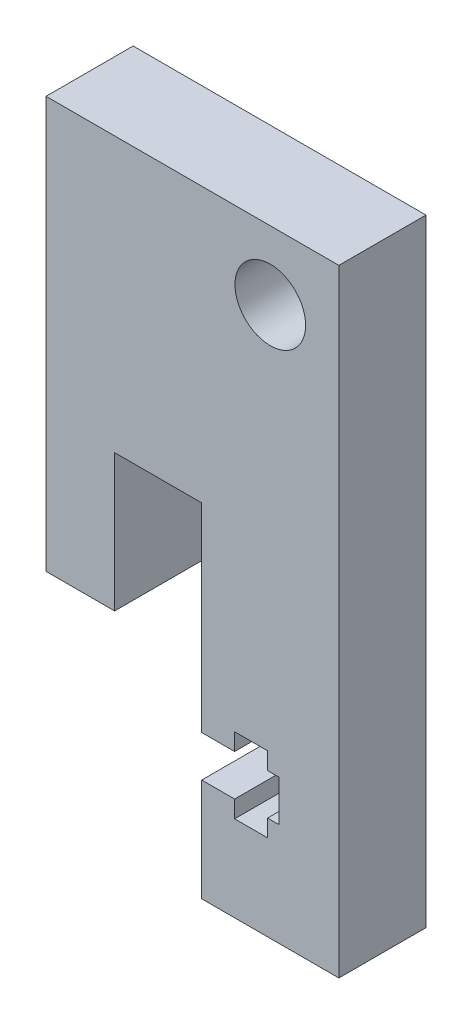
ISO-10303-21;
HEADER;
FILE_DESCRIPTION(('STEP AP214'),'2;1');
FILE_NAME('part.step','',(''),(''),'','','');
FILE_SCHEMA(('AUTOMOTIVE_DESIGN { 1 0 10303 214 1 1 1 1 }'));
ENDSEC;
DATA;
#1=APPLICATION_CONTEXT('core data for automotive mechanical design processes');
#2=APPLICATION_PROTOCOL_DEFINITION('international standard','automotive_design',2000,#1);
#3=PRODUCT_CONTEXT('',#1,'mechanical');
#4=PRODUCT('Part','Part','',(#3));
#5=PRODUCT_RELATED_PRODUCT_CATEGORY('part','',(#4));
#6=PRODUCT_DEFINITION_FORMATION('','',#4);
#7=PRODUCT_DEFINITION_CONTEXT('part definition',#1,'design');
#8=PRODUCT_DEFINITION('design','',#6,#7);
#9=PRODUCT_DEFINITION_SHAPE('','',#8);
#10=(LENGTH_UNIT() NAMED_UNIT(*) SI_UNIT(.MILLI.,.METRE.));
#11=(NAMED_UNIT(*) PLANE_ANGLE_UNIT() SI_UNIT($,.RADIAN.));
#12=(NAMED_UNIT(*) SI_UNIT($,.STERADIAN.) SOLID_ANGLE_UNIT());
#13=UNCERTAINTY_MEASURE_WITH_UNIT(LENGTH_MEASURE(1.E-05),#10,'distance_accuracy_value','');
#14=(GEOMETRIC_REPRESENTATION_CONTEXT(3) GLOBAL_UNCERTAINTY_ASSIGNED_CONTEXT((#13)) GLOBAL_UNIT_ASSIGNED_CONTEXT((#10,
#11,#12)) REPRESENTATION_CONTEXT('',''));
#15=CARTESIAN_POINT('',(0.,0.,0.));
#16=DIRECTION('',(0.,0.,1.));
#17=DIRECTION('',(1.,0.,0.));
#18=AXIS2_PLACEMENT_3D('',#15,#16,#17);
#19=CARTESIAN_POINT('',(0.940553214138688,0.,6.35));
#20=DIRECTION('',(-1.,0.,0.));
#21=DIRECTION('',(0.,-1.,0.));
#22=AXIS2_PLACEMENT_3D('',#19,#20,#21);
#23=PLANE('',#22);
#24=DIRECTION('',(0.,1.,0.));
#25=VECTOR('',#24,1.);
#26=CARTESIAN_POINT('',(0.940553214138688,0.,0.));
#27=LINE('',#26,#25);
#28=CARTESIAN_POINT('',(0.940553214138688,-4.5332697036601,0.));
#29=VERTEX_POINT('',#28);
#30=CARTESIAN_POINT('',(0.940553214138688,-3.2832697036601,0.));
#31=VERTEX_POINT('',#30);
#32=EDGE_CURVE('E217',#29,#31,#27,.T.);
#33=ORIENTED_EDGE('',*,*,#32,.T.);
#34=DIRECTION('',(0.,0.,-1.));
#35=VECTOR('',#34,1.);
#36=CARTESIAN_POINT('',(0.940553214138688,-3.2832697036601,6.35));
#37=LINE('',#36,#35);
#38=CARTESIAN_POINT('',(0.940553214138688,-3.2832697036601,6.35));
#39=VERTEX_POINT('',#38);
#40=EDGE_CURVE('E11',#39,#31,#37,.T.);
#41=ORIENTED_EDGE('',*,*,#40,.F.);
#42=DIRECTION('',(0.,1.,0.));
#43=VECTOR('',#42,1.);
#44=CARTESIAN_POINT('',(0.940553214138688,0.,6.35));
#45=LINE('',#44,#43);
#46=CARTESIAN_POINT('',(0.940553214138688,-4.5332697036601,6.35));
#47=VERTEX_POINT('',#46);
#48=EDGE_CURVE('E363',#47,#39,#45,.T.);
#49=ORIENTED_EDGE('',*,*,#48,.F.);
#50=DIRECTION('',(0.,0.,-1.));
#51=VECTOR('',#50,1.);
#52=CARTESIAN_POINT('',(0.940553214138688,-4.5332697036601,6.35));
#53=LINE('',#52,#51);
#54=EDGE_CURVE('E209',#47,#29,#53,.T.);
#55=ORIENTED_EDGE('',*,*,#54,.T.);
#56=EDGE_LOOP('',(#33,#41,#49,#55));
#57=FACE_BOUND('',#56,.T.);
#58=ADVANCED_FACE('F39',(#57),#23,.F.);
#59=CARTESIAN_POINT('',(0.,-3.2832697036601,6.35));
#60=DIRECTION('',(0.,-1.,0.));
#61=DIRECTION('',(0.,0.,-1.));
#62=AXIS2_PLACEMENT_3D('',#59,#60,#61);
#63=PLANE('',#62);
#64=DIRECTION('',(-1.,0.,0.));
#65=VECTOR('',#64,1.);
#66=CARTESIAN_POINT('',(0.,-3.2832697036601,0.));
#67=LINE('',#66,#65);
#68=CARTESIAN_POINT('',(-1.45944678586131,-3.2832697036601,0.));
#69=VERTEX_POINT('',#68);
#70=EDGE_CURVE('E221',#31,#69,#67,.T.);
#71=ORIENTED_EDGE('',*,*,#70,.T.);
#72=DIRECTION('',(0.,0.,-1.));
#73=VECTOR('',#72,1.);
#74=CARTESIAN_POINT('',(-1.45944678586131,-3.2832697036601,6.35));
#75=LINE('',#74,#73);
#76=CARTESIAN_POINT('',(-1.45944678586131,-3.2832697036601,6.35));
#77=VERTEX_POINT('',#76);
#78=EDGE_CURVE('E49',#77,#69,#75,.T.);
#79=ORIENTED_EDGE('',*,*,#78,.F.);
#80=DIRECTION('',(-1.,0.,0.));
#81=VECTOR('',#80,1.);
#82=CARTESIAN_POINT('',(0.,-3.2832697036601,6.35));
#83=LINE('',#82,#81);
#84=EDGE_CURVE('E136',#39,#77,#83,.T.);
#85=ORIENTED_EDGE('',*,*,#84,.F.);
#86=ORIENTED_EDGE('',*,*,#40,.T.);
#87=EDGE_LOOP('',(#71,#79,#85,#86));
#88=FACE_BOUND('',#87,.T.);
#89=ADVANCED_FACE('F342',(#88),#63,.F.);
#90=CARTESIAN_POINT('',(-1.45944678586131,0.,6.35));
#91=DIRECTION('',(-1.,0.,0.));
#92=DIRECTION('',(0.,0.,1.));
#93=AXIS2_PLACEMENT_3D('',#90,#91,#92);
#94=PLANE('',#93);
#95=DIRECTION('',(0.,1.,0.));
#96=VECTOR('',#95,1.);
#97=CARTESIAN_POINT('',(-1.45944678586131,0.,0.));
#98=LINE('',#97,#96);
#99=CARTESIAN_POINT('',(-1.45944678586131,-10.7832697036601,0.));
#100=VERTEX_POINT('',#99);
#101=EDGE_CURVE('E225',#100,#69,#98,.T.);
#102=ORIENTED_EDGE('',*,*,#101,.F.);
#103=DIRECTION('',(0.,0.,-1.));
#104=VECTOR('',#103,1.);
#105=CARTESIAN_POINT('',(-1.45944678586131,-10.7832697036601,6.35));
#106=LINE('',#105,#104);
#107=CARTESIAN_POINT('',(-1.45944678586131,-10.7832697036601,6.35));
#108=VERTEX_POINT('',#107);
#109=EDGE_CURVE('E333',#108,#100,#106,.T.);
#110=ORIENTED_EDGE('',*,*,#109,.F.);
#111=DIRECTION('',(0.,1.,0.));
#112=VECTOR('',#111,1.);
#113=CARTESIAN_POINT('',(-1.45944678586131,0.,6.35));
#114=LINE('',#113,#112);
#115=EDGE_CURVE('E341',#108,#77,#114,.T.);
#116=ORIENTED_EDGE('',*,*,#115,.T.);
#117=ORIENTED_EDGE('',*,*,#78,.T.);
#118=EDGE_LOOP('',(#102,#110,#116,#117));
#119=FACE_BOUND('',#118,.T.);
#120=ADVANCED_FACE('F339',(#119),#94,.T.);
#121=CARTESIAN_POINT('',(0.,-10.7832697036601,6.35));
#122=DIRECTION('',(0.,-1.,0.));
#123=DIRECTION('',(0.,0.,-1.));
#124=AXIS2_PLACEMENT_3D('',#121,#122,#123);
#125=PLANE('',#124);
#126=DIRECTION('',(-1.,0.,0.));
#127=VECTOR('',#126,1.);
#128=CARTESIAN_POINT('',(0.,-10.7832697036601,0.));
#129=LINE('',#128,#127);
#130=CARTESIAN_POINT('',(8.54055321413869,-10.7832697036601,0.));
#131=VERTEX_POINT('',#130);
#132=EDGE_CURVE('E229',#131,#100,#129,.T.);
#133=ORIENTED_EDGE('',*,*,#132,.F.);
#134=DIRECTION('',(0.,0.,-1.));
#135=VECTOR('',#134,1.);
#136=CARTESIAN_POINT('',(8.54055321413869,-10.7832697036601,6.35));
#137=LINE('',#136,#135);
#138=CARTESIAN_POINT('',(8.54055321413869,-10.7832697036601,6.35));
#139=VERTEX_POINT('',#138);
#140=EDGE_CURVE('E330',#139,#131,#137,.T.);
#141=ORIENTED_EDGE('',*,*,#140,.F.);
#142=DIRECTION('',(-1.,0.,0.));
#143=VECTOR('',#142,1.);
#144=CARTESIAN_POINT('',(0.,-10.7832697036601,6.35));
#145=LINE('',#144,#143);
#146=EDGE_CURVE('E353',#139,#108,#145,.T.);
#147=ORIENTED_EDGE('',*,*,#146,.T.);
#148=ORIENTED_EDGE('',*,*,#109,.T.);
#149=EDGE_LOOP('',(#133,#141,#147,#148));
#150=FACE_BOUND('',#149,.T.);
#151=ADVANCED_FACE('F350',(#150),#125,.T.);
#152=CARTESIAN_POINT('',(8.54055321413869,0.,6.35));
#153=DIRECTION('',(1.,0.,0.));
#154=DIRECTION('',(0.,1.,0.));
#155=AXIS2_PLACEMENT_3D('',#152,#153,#154);
#156=PLANE('',#155);
#157=DIRECTION('',(0.,-1.,0.));
#158=VECTOR('',#157,1.);
#159=CARTESIAN_POINT('',(8.54055321413869,0.,0.));
#160=LINE('',#159,#158);
#161=CARTESIAN_POINT('',(8.54055321413868,34.2167302963399,0.));
#162=VERTEX_POINT('',#161);
#163=EDGE_CURVE('E234',#162,#131,#160,.T.);
#164=ORIENTED_EDGE('',*,*,#163,.F.);
#165=DIRECTION('',(0.,0.,-1.));
#166=VECTOR('',#165,1.);
#167=CARTESIAN_POINT('',(8.54055321413868,34.2167302963399,6.35));
#168=LINE('',#167,#166);
#169=CARTESIAN_POINT('',(8.54055321413868,34.2167302963399,6.35));
#170=VERTEX_POINT('',#169);
#171=EDGE_CURVE('E327',#170,#162,#168,.T.);
#172=ORIENTED_EDGE('',*,*,#171,.F.);
#173=DIRECTION('',(0.,-1.,0.));
#174=VECTOR('',#173,1.);
#175=CARTESIAN_POINT('',(8.54055321413869,0.,6.35));
#176=LINE('',#175,#174);
#177=EDGE_CURVE('E361',#170,#139,#176,.T.);
#178=ORIENTED_EDGE('',*,*,#177,.T.);
#179=ORIENTED_EDGE('',*,*,#140,.T.);
#180=EDGE_LOOP('',(#164,#172,#178,#179));
#181=FACE_BOUND('',#180,.T.);
#182=ADVANCED_FACE('F429',(#181),#156,.T.);
#183=CARTESIAN_POINT('',(0.,34.2167302963399,6.35));
#184=DIRECTION('',(0.,1.,0.));
#185=DIRECTION('',(0.,0.,1.));
#186=AXIS2_PLACEMENT_3D('',#183,#184,#185);
#187=PLANE('',#186);
#188=DIRECTION('',(1.,0.,0.));
#189=VECTOR('',#188,1.);
#190=CARTESIAN_POINT('',(0.,34.2167302963399,0.));
#191=LINE('',#190,#189);
#192=CARTESIAN_POINT('',(-12.8094467858613,34.2167302963399,0.));
#193=VERTEX_POINT('',#192);
#194=EDGE_CURVE('E238',#193,#162,#191,.T.);
#195=ORIENTED_EDGE('',*,*,#194,.F.);
#196=DIRECTION('',(0.,0.,-1.));
#197=VECTOR('',#196,1.);
#198=CARTESIAN_POINT('',(-12.8094467858613,34.2167302963399,6.35));
#199=LINE('',#198,#197);
#200=CARTESIAN_POINT('',(-12.8094467858613,34.2167302963399,6.35));
#201=VERTEX_POINT('',#200);
#202=EDGE_CURVE('E324',#201,#193,#199,.T.);
#203=ORIENTED_EDGE('',*,*,#202,.F.);
#204=DIRECTION('',(1.,0.,0.));
#205=VECTOR('',#204,1.);
#206=CARTESIAN_POINT('',(0.,34.2167302963399,6.35));
#207=LINE('',#206,#205);
#208=EDGE_CURVE('E647',#201,#170,#207,.T.);
#209=ORIENTED_EDGE('',*,*,#208,.T.);
#210=ORIENTED_EDGE('',*,*,#171,.T.);
#211=EDGE_LOOP('',(#195,#203,#209,#210));
#212=FACE_BOUND('',#211,.T.);
#213=ADVANCED_FACE('F432',(#212),#187,.T.);
#214=CARTESIAN_POINT('',(-12.8094467858613,0.,6.35));
#215=DIRECTION('',(-1.,0.,0.));
#216=DIRECTION('',(0.,0.,1.));
#217=AXIS2_PLACEMENT_3D('',#214,#215,#216);
#218=PLANE('',#217);
#219=DIRECTION('',(0.,1.,0.));
#220=VECTOR('',#219,1.);
#221=CARTESIAN_POINT('',(-12.8094467858613,0.,0.));
#222=LINE('',#221,#220);
#223=CARTESIAN_POINT('',(-12.8094467858613,4.2167302963399,0.));
#224=VERTEX_POINT('',#223);
#225=EDGE_CURVE('E242',#224,#193,#222,.T.);
#226=ORIENTED_EDGE('',*,*,#225,.F.);
#227=DIRECTION('',(0.,0.,-1.));
#228=VECTOR('',#227,1.);
#229=CARTESIAN_POINT('',(-12.8094467858613,4.2167302963399,6.35));
#230=LINE('',#229,#228);
#231=CARTESIAN_POINT('',(-12.8094467858613,4.2167302963399,6.35));
#232=VERTEX_POINT('',#231);
#233=EDGE_CURVE('E321',#232,#224,#230,.T.);
#234=ORIENTED_EDGE('',*,*,#233,.F.);
#235=DIRECTION('',(0.,1.,0.));
#236=VECTOR('',#235,1.);
#237=CARTESIAN_POINT('',(-12.8094467858613,0.,6.35));
#238=LINE('',#237,#236);
#239=EDGE_CURVE('E651',#232,#201,#238,.T.);
#240=ORIENTED_EDGE('',*,*,#239,.T.);
#241=ORIENTED_EDGE('',*,*,#202,.T.);
#242=EDGE_LOOP('',(#226,#234,#240,#241));
#243=FACE_BOUND('',#242,.T.);
#244=ADVANCED_FACE('F436',(#243),#218,.T.);
#245=CARTESIAN_POINT('',(0.,4.21673029633989,6.35));
#246=DIRECTION('',(0.,-1.,0.));
#247=DIRECTION('',(1.,0.,0.));
#248=AXIS2_PLACEMENT_3D('',#245,#246,#247);
#249=PLANE('',#248);
#250=DIRECTION('',(-1.,0.,0.));
#251=VECTOR('',#250,1.);
#252=CARTESIAN_POINT('',(0.,4.21673029633989,0.));
#253=LINE('',#252,#251);
#254=CARTESIAN_POINT('',(-7.80944678586131,4.2167302963399,0.));
#255=VERTEX_POINT('',#254);
#256=EDGE_CURVE('E246',#255,#224,#253,.T.);
#257=ORIENTED_EDGE('',*,*,#256,.F.);
#258=DIRECTION('',(0.,0.,-1.));
#259=VECTOR('',#258,1.);
#260=CARTESIAN_POINT('',(-7.80944678586131,4.2167302963399,6.35));
#261=LINE('',#260,#259);
#262=CARTESIAN_POINT('',(-7.80944678586131,4.2167302963399,6.35));
#263=VERTEX_POINT('',#262);
#264=EDGE_CURVE('E318',#263,#255,#261,.T.);
#265=ORIENTED_EDGE('',*,*,#264,.F.);
#266=DIRECTION('',(-1.,0.,0.));
#267=VECTOR('',#266,1.);
#268=CARTESIAN_POINT('',(0.,4.21673029633989,6.35));
#269=LINE('',#268,#267);
#270=EDGE_CURVE('E382',#263,#232,#269,.T.);
#271=ORIENTED_EDGE('',*,*,#270,.T.);
#272=ORIENTED_EDGE('',*,*,#233,.T.);
#273=EDGE_LOOP('',(#257,#265,#271,#272));
#274=FACE_BOUND('',#273,.T.);
#275=ADVANCED_FACE('F440',(#274),#249,.T.);
#276=CARTESIAN_POINT('',(-7.80944678586131,0.,6.35));
#277=DIRECTION('',(1.,0.,0.));
#278=DIRECTION('',(0.,1.,0.));
#279=AXIS2_PLACEMENT_3D('',#276,#277,#278);
#280=PLANE('',#279);
#281=DIRECTION('',(0.,-1.,0.));
#282=VECTOR('',#281,1.);
#283=CARTESIAN_POINT('',(-7.80944678586131,0.,0.));
#284=LINE('',#283,#282);
#285=CARTESIAN_POINT('',(-7.80944678586131,14.2167302963399,0.));
#286=VERTEX_POINT('',#285);
#287=EDGE_CURVE('E250',#286,#255,#284,.T.);
#288=ORIENTED_EDGE('',*,*,#287,.F.);
#289=DIRECTION('',(0.,0.,-1.));
#290=VECTOR('',#289,1.);
#291=CARTESIAN_POINT('',(-7.80944678586131,14.2167302963399,6.35));
#292=LINE('',#291,#290);
#293=CARTESIAN_POINT('',(-7.80944678586131,14.2167302963399,6.35));
#294=VERTEX_POINT('',#293);
#295=EDGE_CURVE('E315',#294,#286,#292,.T.);
#296=ORIENTED_EDGE('',*,*,#295,.F.);
#297=DIRECTION('',(0.,-1.,0.));
#298=VECTOR('',#297,1.);
#299=CARTESIAN_POINT('',(-7.80944678586131,0.,6.35));
#300=LINE('',#299,#298);
#301=EDGE_CURVE('E376',#294,#263,#300,.T.);
#302=ORIENTED_EDGE('',*,*,#301,.T.);
#303=ORIENTED_EDGE('',*,*,#264,.T.);
#304=EDGE_LOOP('',(#288,#296,#302,#303));
#305=FACE_BOUND('',#304,.T.);
#306=ADVANCED_FACE('F444',(#305),#280,.T.);
#307=CARTESIAN_POINT('',(0.,14.2167302963399,6.35));
#308=DIRECTION('',(0.,-1.,0.));
#309=DIRECTION('',(0.,0.,-1.));
#310=AXIS2_PLACEMENT_3D('',#307,#308,#309);
#311=PLANE('',#310);
#312=DIRECTION('',(-1.,0.,0.));
#313=VECTOR('',#312,1.);
#314=CARTESIAN_POINT('',(0.,14.2167302963399,0.));
#315=LINE('',#314,#313);
#316=CARTESIAN_POINT('',(-1.45944678586131,14.2167302963399,0.));
#317=VERTEX_POINT('',#316);
#318=EDGE_CURVE('E254',#317,#286,#315,.T.);
#319=ORIENTED_EDGE('',*,*,#318,.F.);
#320=DIRECTION('',(0.,0.,-1.));
#321=VECTOR('',#320,1.);
#322=CARTESIAN_POINT('',(-1.45944678586131,14.2167302963399,6.35));
#323=LINE('',#322,#321);
#324=CARTESIAN_POINT('',(-1.45944678586131,14.2167302963399,6.35));
#325=VERTEX_POINT('',#324);
#326=EDGE_CURVE('E312',#325,#317,#323,.T.);
#327=ORIENTED_EDGE('',*,*,#326,.F.);
#328=DIRECTION('',(-1.,0.,0.));
#329=VECTOR('',#328,1.);
#330=CARTESIAN_POINT('',(0.,14.2167302963399,6.35));
#331=LINE('',#330,#329);
#332=EDGE_CURVE('E368',#325,#294,#331,.T.);
#333=ORIENTED_EDGE('',*,*,#332,.T.);
#334=ORIENTED_EDGE('',*,*,#295,.T.);
#335=EDGE_LOOP('',(#319,#327,#333,#334));
#336=FACE_BOUND('',#335,.T.);
#337=ADVANCED_FACE('F448',(#336),#311,.T.);
#338=CARTESIAN_POINT('',(-1.45944678586131,-0.283269703660103,0.));
#339=VERTEX_POINT('',#338);
#340=EDGE_CURVE('E230',#339,#317,#98,.T.);
#341=ORIENTED_EDGE('',*,*,#340,.F.);
#342=DIRECTION('',(0.,0.,-1.));
#343=VECTOR('',#342,1.);
#344=CARTESIAN_POINT('',(-1.45944678586131,-0.283269703660103,6.35));
#345=LINE('',#344,#343);
#346=CARTESIAN_POINT('',(-1.45944678586131,-0.283269703660103,6.35));
#347=VERTEX_POINT('',#346);
#348=EDGE_CURVE('E309',#347,#339,#345,.T.);
#349=ORIENTED_EDGE('',*,*,#348,.F.);
#350=EDGE_CURVE('E358',#347,#325,#114,.T.);
#351=ORIENTED_EDGE('',*,*,#350,.T.);
#352=ORIENTED_EDGE('',*,*,#326,.T.);
#353=EDGE_LOOP('',(#341,#349,#351,#352));
#354=FACE_BOUND('',#353,.T.);
#355=ADVANCED_FACE('F452',(#354),#94,.T.);
#356=CARTESIAN_POINT('',(0.,-0.283269703660103,6.35));
#357=DIRECTION('',(0.,1.,0.));
#358=DIRECTION('',(-1.,0.,0.));
#359=AXIS2_PLACEMENT_3D('',#356,#357,#358);
#360=PLANE('',#359);
#361=DIRECTION('',(1.,0.,0.));
#362=VECTOR('',#361,1.);
#363=CARTESIAN_POINT('',(0.,-0.283269703660103,0.));
#364=LINE('',#363,#362);
#365=CARTESIAN_POINT('',(0.940553214138687,-0.283269703660102,0.));
#366=VERTEX_POINT('',#365);
#367=EDGE_CURVE('E258',#339,#366,#364,.T.);
#368=ORIENTED_EDGE('',*,*,#367,.T.);
#369=DIRECTION('',(0.,0.,-1.));
#370=VECTOR('',#369,1.);
#371=CARTESIAN_POINT('',(0.940553214138687,-0.283269703660102,6.35));
#372=LINE('',#371,#370);
#373=CARTESIAN_POINT('',(0.940553214138687,-0.283269703660102,6.35));
#374=VERTEX_POINT('',#373);
#375=EDGE_CURVE('E305',#374,#366,#372,.T.);
#376=ORIENTED_EDGE('',*,*,#375,.F.);
#377=DIRECTION('',(1.,0.,0.));
#378=VECTOR('',#377,1.);
#379=CARTESIAN_POINT('',(0.,-0.283269703660103,6.35));
#380=LINE('',#379,#378);
#381=EDGE_CURVE('E367',#347,#374,#380,.T.);
#382=ORIENTED_EDGE('',*,*,#381,.F.);
#383=ORIENTED_EDGE('',*,*,#348,.T.);
#384=EDGE_LOOP('',(#368,#376,#382,#383));
#385=FACE_BOUND('',#384,.T.);
#386=ADVANCED_FACE('F455',(#385),#360,.F.);
#387=CARTESIAN_POINT('',(0.940553214138687,0.,6.35));
#388=DIRECTION('',(-1.,0.,0.));
#389=DIRECTION('',(0.,-1.,0.));
#390=AXIS2_PLACEMENT_3D('',#387,#388,#389);
#391=PLANE('',#390);
#392=DIRECTION('',(0.,1.,0.));
#393=VECTOR('',#392,1.);
#394=CARTESIAN_POINT('',(0.940553214138687,0.,0.));
#395=LINE('',#394,#393);
#396=CARTESIAN_POINT('',(0.940553214138687,0.966730296339899,0.));
#397=VERTEX_POINT('',#396);
#398=EDGE_CURVE('E261',#366,#397,#395,.T.);
#399=ORIENTED_EDGE('',*,*,#398,.T.);
#400=DIRECTION('',(0.,0.,-1.));
#401=VECTOR('',#400,1.);
#402=CARTESIAN_POINT('',(0.940553214138687,0.966730296339899,6.35));
#403=LINE('',#402,#401);
#404=CARTESIAN_POINT('',(0.940553214138687,0.966730296339899,6.35));
#405=VERTEX_POINT('',#404);
#406=EDGE_CURVE('E301',#405,#397,#403,.T.);
#407=ORIENTED_EDGE('',*,*,#406,.F.);
#408=DIRECTION('',(0.,1.,0.));
#409=VECTOR('',#408,1.);
#410=CARTESIAN_POINT('',(0.940553214138687,0.,6.35));
#411=LINE('',#410,#409);
#412=EDGE_CURVE('E373',#374,#405,#411,.T.);
#413=ORIENTED_EDGE('',*,*,#412,.F.);
#414=ORIENTED_EDGE('',*,*,#375,.T.);
#415=EDGE_LOOP('',(#399,#407,#413,#414));
#416=FACE_BOUND('',#415,.T.);
#417=ADVANCED_FACE('F458',(#416),#391,.F.);
#418=CARTESIAN_POINT('',(0.,0.966730296339899,6.35));
#419=DIRECTION('',(0.,1.,0.));
#420=DIRECTION('',(0.,0.,1.));
#421=AXIS2_PLACEMENT_3D('',#418,#419,#420);
#422=PLANE('',#421);
#423=DIRECTION('',(1.,0.,0.));
#424=VECTOR('',#423,1.);
#425=CARTESIAN_POINT('',(0.,0.966730296339899,0.));
#426=LINE('',#425,#424);
#427=CARTESIAN_POINT('',(3.34055321413869,0.966730296339899,0.));
#428=VERTEX_POINT('',#427);
#429=EDGE_CURVE('E264',#397,#428,#426,.T.);
#430=ORIENTED_EDGE('',*,*,#429,.T.);
#431=DIRECTION('',(0.,0.,-1.));
#432=VECTOR('',#431,1.);
#433=CARTESIAN_POINT('',(3.34055321413869,0.966730296339899,6.35));
#434=LINE('',#433,#432);
#435=CARTESIAN_POINT('',(3.34055321413869,0.966730296339899,6.35));
#436=VERTEX_POINT('',#435);
#437=EDGE_CURVE('E297',#436,#428,#434,.T.);
#438=ORIENTED_EDGE('',*,*,#437,.F.);
#439=DIRECTION('',(1.,0.,0.));
#440=VECTOR('',#439,1.);
#441=CARTESIAN_POINT('',(0.,0.966730296339899,6.35));
#442=LINE('',#441,#440);
#443=EDGE_CURVE('E388',#405,#436,#442,.T.);
#444=ORIENTED_EDGE('',*,*,#443,.F.);
#445=ORIENTED_EDGE('',*,*,#406,.T.);
#446=EDGE_LOOP('',(#430,#438,#444,#445));
#447=FACE_BOUND('',#446,.T.);
#448=ADVANCED_FACE('F462',(#447),#422,.F.);
#449=CARTESIAN_POINT('',(3.34055321413869,0.,6.35));
#450=DIRECTION('',(1.,0.,0.));
#451=DIRECTION('',(0.,1.,0.));
#452=AXIS2_PLACEMENT_3D('',#449,#450,#451);
#453=PLANE('',#452);
#454=DIRECTION('',(0.,-1.,0.));
#455=VECTOR('',#454,1.);
#456=CARTESIAN_POINT('',(3.34055321413869,0.,0.));
#457=LINE('',#456,#455);
#458=CARTESIAN_POINT('',(3.34055321413868,-0.2832697036601,0.));
#459=VERTEX_POINT('',#458);
#460=EDGE_CURVE('E267',#428,#459,#457,.T.);
#461=ORIENTED_EDGE('',*,*,#460,.T.);
#462=DIRECTION('',(0.,0.,-1.));
#463=VECTOR('',#462,1.);
#464=CARTESIAN_POINT('',(3.34055321413868,-0.2832697036601,6.35));
#465=LINE('',#464,#463);
#466=CARTESIAN_POINT('',(3.34055321413868,-0.2832697036601,6.35));
#467=VERTEX_POINT('',#466);
#468=EDGE_CURVE('E293',#467,#459,#465,.T.);
#469=ORIENTED_EDGE('',*,*,#468,.F.);
#470=DIRECTION('',(0.,-1.,0.));
#471=VECTOR('',#470,1.);
#472=CARTESIAN_POINT('',(3.34055321413869,0.,6.35));
#473=LINE('',#472,#471);
#474=EDGE_CURVE('E391',#436,#467,#473,.T.);
#475=ORIENTED_EDGE('',*,*,#474,.F.);
#476=ORIENTED_EDGE('',*,*,#437,.T.);
#477=EDGE_LOOP('',(#461,#469,#475,#476));
#478=FACE_BOUND('',#477,.T.);
#479=ADVANCED_FACE('F466',(#478),#453,.F.);
#480=CARTESIAN_POINT('',(0.,-0.283269703660095,6.35));
#481=DIRECTION('',(0.,1.,0.));
#482=DIRECTION('',(-1.,0.,0.));
#483=AXIS2_PLACEMENT_3D('',#480,#481,#482);
#484=PLANE('',#483);
#485=DIRECTION('',(1.,0.,0.));
#486=VECTOR('',#485,1.);
#487=CARTESIAN_POINT('',(0.,-0.283269703660095,0.));
#488=LINE('',#487,#486);
#489=CARTESIAN_POINT('',(4.19055321413868,-0.283269703660102,0.));
#490=VERTEX_POINT('',#489);
#491=EDGE_CURVE('E270',#459,#490,#488,.T.);
#492=ORIENTED_EDGE('',*,*,#491,.T.);
#493=DIRECTION('',(0.,0.,-1.));
#494=VECTOR('',#493,1.);
#495=CARTESIAN_POINT('',(4.19055321413868,-0.283269703660102,6.35));
#496=LINE('',#495,#494);
#497=CARTESIAN_POINT('',(4.19055321413868,-0.283269703660102,6.35));
#498=VERTEX_POINT('',#497);
#499=EDGE_CURVE('E289',#498,#490,#496,.T.);
#500=ORIENTED_EDGE('',*,*,#499,.F.);
#501=DIRECTION('',(1.,0.,0.));
#502=VECTOR('',#501,1.);
#503=CARTESIAN_POINT('',(0.,-0.283269703660095,6.35));
#504=LINE('',#503,#502);
#505=EDGE_CURVE('E394',#467,#498,#504,.T.);
#506=ORIENTED_EDGE('',*,*,#505,.F.);
#507=ORIENTED_EDGE('',*,*,#468,.T.);
#508=EDGE_LOOP('',(#492,#500,#506,#507));
#509=FACE_BOUND('',#508,.T.);
#510=ADVANCED_FACE('F402',(#509),#484,.F.);
#511=CARTESIAN_POINT('',(4.19055321413868,0.,6.35));
#512=DIRECTION('',(1.,0.,0.));
#513=DIRECTION('',(0.,1.,0.));
#514=AXIS2_PLACEMENT_3D('',#511,#512,#513);
#515=PLANE('',#514);
#516=DIRECTION('',(0.,-1.,0.));
#517=VECTOR('',#516,1.);
#518=CARTESIAN_POINT('',(4.19055321413868,0.,0.));
#519=LINE('',#518,#517);
#520=CARTESIAN_POINT('',(4.19055321413868,-3.2832697036601,0.));
#521=VERTEX_POINT('',#520);
#522=EDGE_CURVE('E273',#490,#521,#519,.T.);
#523=ORIENTED_EDGE('',*,*,#522,.T.);
#524=DIRECTION('',(0.,0.,-1.));
#525=VECTOR('',#524,1.);
#526=CARTESIAN_POINT('',(4.19055321413868,-3.2832697036601,6.35));
#527=LINE('',#526,#525);
#528=CARTESIAN_POINT('',(4.19055321413868,-3.2832697036601,6.35));
#529=VERTEX_POINT('',#528);
#530=EDGE_CURVE('E202',#529,#521,#527,.T.);
#531=ORIENTED_EDGE('',*,*,#530,.F.);
#532=DIRECTION('',(0.,-1.,0.));
#533=VECTOR('',#532,1.);
#534=CARTESIAN_POINT('',(4.19055321413868,0.,6.35));
#535=LINE('',#534,#533);
#536=EDGE_CURVE('E191',#498,#529,#535,.T.);
#537=ORIENTED_EDGE('',*,*,#536,.F.);
#538=ORIENTED_EDGE('',*,*,#499,.T.);
#539=EDGE_LOOP('',(#523,#531,#537,#538));
#540=FACE_BOUND('',#539,.T.);
#541=ADVANCED_FACE('F406',(#540),#515,.F.);
#542=CARTESIAN_POINT('',(0.,-3.2832697036601,6.35));
#543=DIRECTION('',(0.,-1.,0.));
#544=DIRECTION('',(0.,0.,-1.));
#545=AXIS2_PLACEMENT_3D('',#542,#543,#544);
#546=PLANE('',#545);
#547=DIRECTION('',(-1.,0.,0.));
#548=VECTOR('',#547,1.);
#549=CARTESIAN_POINT('',(0.,-3.2832697036601,0.));
#550=LINE('',#549,#548);
#551=CARTESIAN_POINT('',(3.34055321413869,-3.2832697036601,0.));
#552=VERTEX_POINT('',#551);
#553=EDGE_CURVE('E200',#521,#552,#550,.T.);
#554=ORIENTED_EDGE('',*,*,#553,.T.);
#555=DIRECTION('',(0.,0.,-1.));
#556=VECTOR('',#555,1.);
#557=CARTESIAN_POINT('',(3.34055321413869,-3.2832697036601,6.35));
#558=LINE('',#557,#556);
#559=CARTESIAN_POINT('',(3.34055321413869,-3.2832697036601,6.35));
#560=VERTEX_POINT('',#559);
#561=EDGE_CURVE('E197',#560,#552,#558,.T.);
#562=ORIENTED_EDGE('',*,*,#561,.F.);
#563=DIRECTION('',(-1.,0.,0.));
#564=VECTOR('',#563,1.);
#565=CARTESIAN_POINT('',(0.,-3.2832697036601,6.35));
#566=LINE('',#565,#564);
#567=EDGE_CURVE('E185',#529,#560,#566,.T.);
#568=ORIENTED_EDGE('',*,*,#567,.F.);
#569=ORIENTED_EDGE('',*,*,#530,.T.);
#570=EDGE_LOOP('',(#554,#562,#568,#569));
#571=FACE_BOUND('',#570,.T.);
#572=ADVANCED_FACE('F198',(#571),#546,.F.);
#573=CARTESIAN_POINT('',(3.34055321413868,0.,6.35));
#574=DIRECTION('',(1.,0.,0.));
#575=DIRECTION('',(0.,1.,0.));
#576=AXIS2_PLACEMENT_3D('',#573,#574,#575);
#577=PLANE('',#576);
#578=DIRECTION('',(0.,-1.,0.));
#579=VECTOR('',#578,1.);
#580=CARTESIAN_POINT('',(3.34055321413868,0.,0.));
#581=LINE('',#580,#579);
#582=CARTESIAN_POINT('',(3.34055321413869,-4.5332697036601,0.));
#583=VERTEX_POINT('',#582);
#584=EDGE_CURVE('E122',#552,#583,#581,.T.);
#585=ORIENTED_EDGE('',*,*,#584,.T.);
#586=DIRECTION('',(0.,0.,-1.));
#587=VECTOR('',#586,1.);
#588=CARTESIAN_POINT('',(3.34055321413869,-4.5332697036601,6.35));
#589=LINE('',#588,#587);
#590=CARTESIAN_POINT('',(3.34055321413869,-4.5332697036601,6.35));
#591=VERTEX_POINT('',#590);
#592=EDGE_CURVE('E203',#591,#583,#589,.T.);
#593=ORIENTED_EDGE('',*,*,#592,.F.);
#594=DIRECTION('',(0.,-1.,0.));
#595=VECTOR('',#594,1.);
#596=CARTESIAN_POINT('',(3.34055321413868,0.,6.35));
#597=LINE('',#596,#595);
#598=EDGE_CURVE('E189',#560,#591,#597,.T.);
#599=ORIENTED_EDGE('',*,*,#598,.F.);
#600=ORIENTED_EDGE('',*,*,#561,.T.);
#601=EDGE_LOOP('',(#585,#593,#599,#600));
#602=FACE_BOUND('',#601,.T.);
#603=ADVANCED_FACE('F205',(#602),#577,.F.);
#604=CARTESIAN_POINT('',(3.54055321413869,29.2167302963399,6.35));
#605=DIRECTION('',(0.,0.,-1.));
#606=DIRECTION('',(-1.,0.,0.));
#607=AXIS2_PLACEMENT_3D('',#604,#605,#606);
#608=CYLINDRICAL_SURFACE('',#607,2.575);
#609=CARTESIAN_POINT('',(3.54055321413869,29.2167302963399,6.35));
#610=DIRECTION('',(0.,0.,1.));
#611=DIRECTION('',(1.,0.,0.));
#612=AXIS2_PLACEMENT_3D('',#609,#610,#611);
#613=CIRCLE('',#612,2.575);
#614=CARTESIAN_POINT('',(6.11555321413869,29.2167302963399,6.35));
#615=VERTEX_POINT('',#614);
#616=EDGE_CURVE('E282',#615,#615,#613,.T.);
#617=ORIENTED_EDGE('',*,*,#616,.T.);
#618=EDGE_LOOP('',(#617));
#619=FACE_BOUND('',#618,.T.);
#620=CARTESIAN_POINT('',(3.54055321413869,29.2167302963399,0.));
#621=DIRECTION('',(0.,0.,1.));
#622=DIRECTION('',(1.,0.,0.));
#623=AXIS2_PLACEMENT_3D('',#620,#621,#622);
#624=CIRCLE('',#623,2.575);
#625=CARTESIAN_POINT('',(6.11555321413869,29.2167302963399,0.));
#626=VERTEX_POINT('',#625);
#627=EDGE_CURVE('E213',#626,#626,#624,.T.);
#628=ORIENTED_EDGE('',*,*,#627,.F.);
#629=EDGE_LOOP('',(#628));
#630=FACE_BOUND('',#629,.T.);
#631=ADVANCED_FACE('F41',(#619,#630),#608,.F.);
#632=CARTESIAN_POINT('',(0.,-4.5332697036601,6.35));
#633=DIRECTION('',(0.,-1.,0.));
#634=DIRECTION('',(0.,0.,-1.));
#635=AXIS2_PLACEMENT_3D('',#632,#633,#634);
#636=PLANE('',#635);
#637=DIRECTION('',(-1.,0.,0.));
#638=VECTOR('',#637,1.);
#639=CARTESIAN_POINT('',(0.,-4.5332697036601,0.));
#640=LINE('',#639,#638);
#641=EDGE_CURVE('E128',#583,#29,#640,.T.);
#642=ORIENTED_EDGE('',*,*,#641,.T.);
#643=ORIENTED_EDGE('',*,*,#54,.F.);
#644=DIRECTION('',(-1.,0.,0.));
#645=VECTOR('',#644,1.);
#646=CARTESIAN_POINT('',(0.,-4.5332697036601,6.35));
#647=LINE('',#646,#645);
#648=EDGE_CURVE('E57',#591,#47,#647,.T.);
#649=ORIENTED_EDGE('',*,*,#648,.F.);
#650=ORIENTED_EDGE('',*,*,#592,.T.);
#651=EDGE_LOOP('',(#642,#643,#649,#650));
#652=FACE_BOUND('',#651,.T.);
#653=ADVANCED_FACE('F409',(#652),#636,.F.);
#654=CARTESIAN_POINT('',(0.,0.,6.35));
#655=DIRECTION('',(0.,0.,1.));
#656=DIRECTION('',(1.,0.,0.));
#657=AXIS2_PLACEMENT_3D('',#654,#655,#656);
#658=PLANE('',#657);
#659=ORIENTED_EDGE('',*,*,#616,.F.);
#660=EDGE_LOOP('',(#659));
#661=FACE_BOUND('',#660,.T.);
#662=ORIENTED_EDGE('',*,*,#48,.T.);
#663=ORIENTED_EDGE('',*,*,#84,.T.);
#664=ORIENTED_EDGE('',*,*,#115,.F.);
#665=ORIENTED_EDGE('',*,*,#146,.F.);
#666=ORIENTED_EDGE('',*,*,#177,.F.);
#667=ORIENTED_EDGE('',*,*,#208,.F.);
#668=ORIENTED_EDGE('',*,*,#239,.F.);
#669=ORIENTED_EDGE('',*,*,#270,.F.);
#670=ORIENTED_EDGE('',*,*,#301,.F.);
#671=ORIENTED_EDGE('',*,*,#332,.F.);
#672=ORIENTED_EDGE('',*,*,#350,.F.);
#673=ORIENTED_EDGE('',*,*,#381,.T.);
#674=ORIENTED_EDGE('',*,*,#412,.T.);
#675=ORIENTED_EDGE('',*,*,#443,.T.);
#676=ORIENTED_EDGE('',*,*,#474,.T.);
#677=ORIENTED_EDGE('',*,*,#505,.T.);
#678=ORIENTED_EDGE('',*,*,#536,.T.);
#679=ORIENTED_EDGE('',*,*,#567,.T.);
#680=ORIENTED_EDGE('',*,*,#598,.T.);
#681=ORIENTED_EDGE('',*,*,#648,.T.);
#682=EDGE_LOOP('',(#662,#663,#664,#665,#666,#667,#668,#669,#670,#671,#672,#673,#674,#675,#676,
#677,#678,#679,#680,#681));
#683=FACE_BOUND('',#682,.T.);
#684=ADVANCED_FACE('F187',(#661,#683),#658,.T.);
#685=CARTESIAN_POINT('',(0.,0.,0.));
#686=DIRECTION('',(0.,0.,1.));
#687=DIRECTION('',(1.,0.,0.));
#688=AXIS2_PLACEMENT_3D('',#685,#686,#687);
#689=PLANE('',#688);
#690=ORIENTED_EDGE('',*,*,#627,.T.);
#691=EDGE_LOOP('',(#690));
#692=FACE_BOUND('',#691,.T.);
#693=ORIENTED_EDGE('',*,*,#32,.F.);
#694=ORIENTED_EDGE('',*,*,#641,.F.);
#695=ORIENTED_EDGE('',*,*,#584,.F.);
#696=ORIENTED_EDGE('',*,*,#553,.F.);
#697=ORIENTED_EDGE('',*,*,#522,.F.);
#698=ORIENTED_EDGE('',*,*,#491,.F.);
#699=ORIENTED_EDGE('',*,*,#460,.F.);
#700=ORIENTED_EDGE('',*,*,#429,.F.);
#701=ORIENTED_EDGE('',*,*,#398,.F.);
#702=ORIENTED_EDGE('',*,*,#367,.F.);
#703=ORIENTED_EDGE('',*,*,#340,.T.);
#704=ORIENTED_EDGE('',*,*,#318,.T.);
#705=ORIENTED_EDGE('',*,*,#287,.T.);
#706=ORIENTED_EDGE('',*,*,#256,.T.);
#707=ORIENTED_EDGE('',*,*,#225,.T.);
#708=ORIENTED_EDGE('',*,*,#194,.T.);
#709=ORIENTED_EDGE('',*,*,#163,.T.);
#710=ORIENTED_EDGE('',*,*,#132,.T.);
#711=ORIENTED_EDGE('',*,*,#101,.T.);
#712=ORIENTED_EDGE('',*,*,#70,.F.);
#713=EDGE_LOOP('',(#693,#694,#695,#696,#697,#698,#699,#700,#701,#702,#703,#704,#705,#706,#707,
#708,#709,#710,#711,#712));
#714=FACE_BOUND('',#713,.T.);
#715=ADVANCED_FACE('F346',(#692,#714),#689,.F.);
#716=CLOSED_SHELL('',(#58,#89,#120,#151,#182,#213,#244,#275,#306,#337,#355,#386,#417,#448,#479,
#510,#541,#572,#603,#631,#653,#684,#715));
#717=MANIFOLD_SOLID_BREP('B2',#716);
#718=ADVANCED_BREP_SHAPE_REPRESENTATION('',(#18,#717),#14);
#719=SHAPE_DEFINITION_REPRESENTATION(#9,#718);
ENDSEC;
END-ISO-10303-21;
